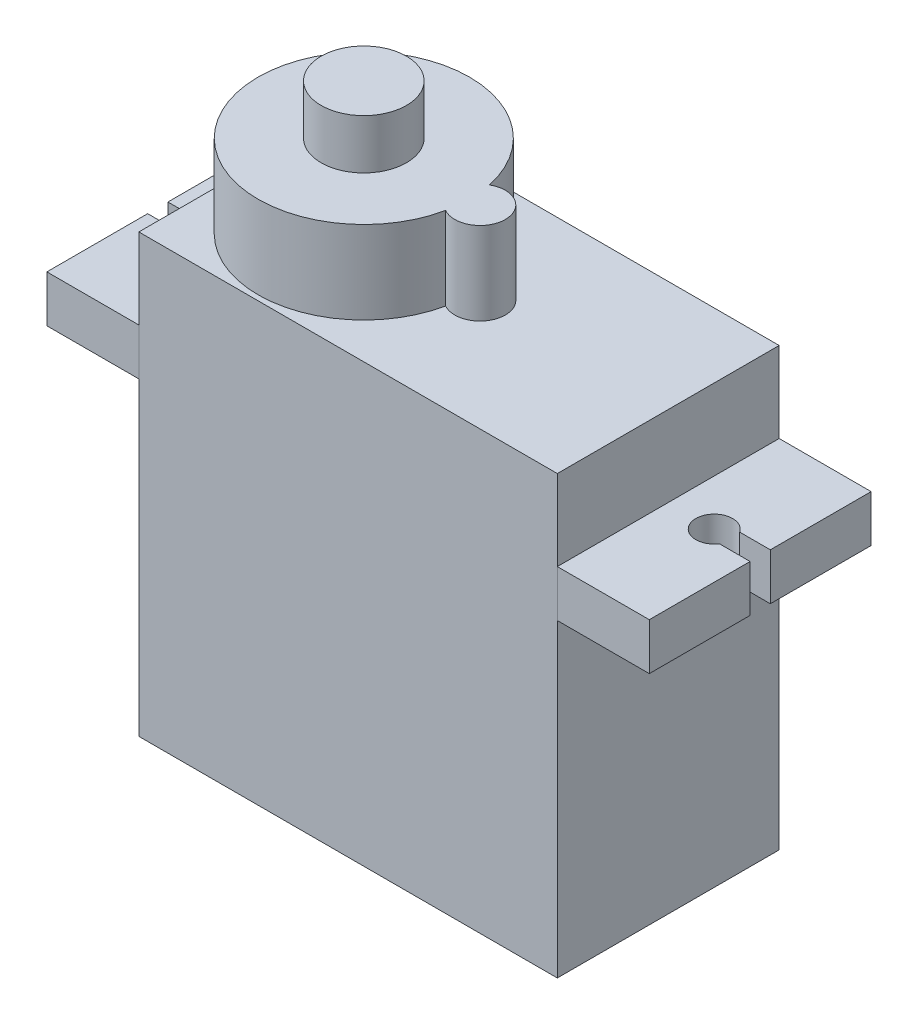
ISO-10303-21;
HEADER;
FILE_DESCRIPTION(('STEP AP214'),'2;1');
FILE_NAME('part.step','',(''),(''),'','','');
FILE_SCHEMA(('AUTOMOTIVE_DESIGN { 1 0 10303 214 1 1 1 1 }'));
ENDSEC;
DATA;
#1=APPLICATION_CONTEXT('core data for automotive mechanical design processes');
#2=APPLICATION_PROTOCOL_DEFINITION('international standard','automotive_design',2000,#1);
#3=PRODUCT_CONTEXT('',#1,'mechanical');
#4=PRODUCT('Part','Part','',(#3));
#5=PRODUCT_RELATED_PRODUCT_CATEGORY('part','',(#4));
#6=PRODUCT_DEFINITION_FORMATION('','',#4);
#7=PRODUCT_DEFINITION_CONTEXT('part definition',#1,'design');
#8=PRODUCT_DEFINITION('design','',#6,#7);
#9=PRODUCT_DEFINITION_SHAPE('','',#8);
#10=(LENGTH_UNIT() NAMED_UNIT(*) SI_UNIT(.MILLI.,.METRE.));
#11=(NAMED_UNIT(*) PLANE_ANGLE_UNIT() SI_UNIT($,.RADIAN.));
#12=(NAMED_UNIT(*) SI_UNIT($,.STERADIAN.) SOLID_ANGLE_UNIT());
#13=UNCERTAINTY_MEASURE_WITH_UNIT(LENGTH_MEASURE(1.E-05),#10,'distance_accuracy_value','');
#14=(GEOMETRIC_REPRESENTATION_CONTEXT(3) GLOBAL_UNCERTAINTY_ASSIGNED_CONTEXT((#13)) GLOBAL_UNIT_ASSIGNED_CONTEXT((#10,
#11,#12)) REPRESENTATION_CONTEXT('',''));
#15=CARTESIAN_POINT('',(0.,0.,0.));
#16=DIRECTION('',(0.,0.,1.));
#17=DIRECTION('',(1.,0.,0.));
#18=AXIS2_PLACEMENT_3D('',#15,#16,#17);
#19=CARTESIAN_POINT('',(-13.675,4.5,1.2));
#20=DIRECTION('',(1.,0.,0.));
#21=DIRECTION('',(0.,0.,-1.));
#22=AXIS2_PLACEMENT_3D('',#19,#20,#21);
#23=CYLINDRICAL_SURFACE('',#22,0.6);
#24=CARTESIAN_POINT('',(-13.675,4.5,1.2));
#25=DIRECTION('',(-1.,0.,0.));
#26=DIRECTION('',(0.,0.,1.));
#27=AXIS2_PLACEMENT_3D('',#24,#25,#26);
#28=CIRCLE('',#27,0.6);
#29=CARTESIAN_POINT('',(-13.675,4.5,1.8));
#30=VERTEX_POINT('',#29);
#31=EDGE_CURVE('E12',#30,#30,#28,.T.);
#32=ORIENTED_EDGE('',*,*,#31,.F.);
#33=EDGE_LOOP('',(#32));
#34=FACE_BOUND('',#33,.T.);
#35=CARTESIAN_POINT('',(-11.375,4.5,1.2));
#36=DIRECTION('',(-1.,0.,0.));
#37=DIRECTION('',(0.,0.,1.));
#38=AXIS2_PLACEMENT_3D('',#35,#36,#37);
#39=CIRCLE('',#38,0.6);
#40=CARTESIAN_POINT('',(-11.375,4.5,1.8));
#41=VERTEX_POINT('',#40);
#42=EDGE_CURVE('E52',#41,#41,#39,.T.);
#43=ORIENTED_EDGE('',*,*,#42,.T.);
#44=EDGE_LOOP('',(#43));
#45=FACE_BOUND('',#44,.T.);
#46=ADVANCED_FACE('F49',(#34,#45),#23,.T.);
#47=CARTESIAN_POINT('',(-13.675,0.,0.));
#48=DIRECTION('',(-1.,0.,0.));
#49=DIRECTION('',(0.,0.,1.));
#50=AXIS2_PLACEMENT_3D('',#47,#48,#49);
#51=PLANE('',#50);
#52=ORIENTED_EDGE('',*,*,#31,.T.);
#53=EDGE_LOOP('',(#52));
#54=FACE_BOUND('',#53,.T.);
#55=ADVANCED_FACE('F64',(#54),#51,.T.);
#56=CARTESIAN_POINT('',(-11.375,0.,0.));
#57=DIRECTION('',(-1.,0.,0.));
#58=DIRECTION('',(0.,0.,1.));
#59=AXIS2_PLACEMENT_3D('',#56,#57,#58);
#60=PLANE('',#59);
#61=ORIENTED_EDGE('',*,*,#42,.F.);
#62=EDGE_LOOP('',(#61));
#63=FACE_BOUND('',#62,.T.);
#64=ADVANCED_FACE('F62',(#63),#60,.F.);
#65=CLOSED_SHELL('',(#46,#55,#64));
#66=MANIFOLD_SOLID_BREP('B2',#65);
#67=CARTESIAN_POINT('',(-13.675,4.5,-1.2));
#68=DIRECTION('',(1.,0.,0.));
#69=DIRECTION('',(0.,0.,-1.));
#70=AXIS2_PLACEMENT_3D('',#67,#68,#69);
#71=CYLINDRICAL_SURFACE('',#70,0.6);
#72=CARTESIAN_POINT('',(-13.675,4.5,-1.2));
#73=DIRECTION('',(-1.,0.,0.));
#74=DIRECTION('',(0.,0.,1.));
#75=AXIS2_PLACEMENT_3D('',#72,#73,#74);
#76=CIRCLE('',#75,0.6);
#77=CARTESIAN_POINT('',(-13.675,4.5,-0.600000000000001));
#78=VERTEX_POINT('',#77);
#79=EDGE_CURVE('E48',#78,#78,#76,.T.);
#80=ORIENTED_EDGE('',*,*,#79,.F.);
#81=EDGE_LOOP('',(#80));
#82=FACE_BOUND('',#81,.T.);
#83=CARTESIAN_POINT('',(-11.375,4.5,-1.2));
#84=DIRECTION('',(-1.,0.,0.));
#85=DIRECTION('',(0.,0.,1.));
#86=AXIS2_PLACEMENT_3D('',#83,#84,#85);
#87=CIRCLE('',#86,0.6);
#88=CARTESIAN_POINT('',(-11.375,4.5,-0.600000000000001));
#89=VERTEX_POINT('',#88);
#90=EDGE_CURVE('E104',#89,#89,#87,.T.);
#91=ORIENTED_EDGE('',*,*,#90,.T.);
#92=EDGE_LOOP('',(#91));
#93=FACE_BOUND('',#92,.T.);
#94=ADVANCED_FACE('F101',(#82,#93),#71,.T.);
#95=CARTESIAN_POINT('',(-13.675,0.,0.));
#96=DIRECTION('',(-1.,0.,0.));
#97=DIRECTION('',(0.,0.,1.));
#98=AXIS2_PLACEMENT_3D('',#95,#96,#97);
#99=PLANE('',#98);
#100=ORIENTED_EDGE('',*,*,#79,.T.);
#101=EDGE_LOOP('',(#100));
#102=FACE_BOUND('',#101,.T.);
#103=ADVANCED_FACE('F116',(#102),#99,.T.);
#104=CARTESIAN_POINT('',(-11.375,0.,0.));
#105=DIRECTION('',(-1.,0.,0.));
#106=DIRECTION('',(0.,0.,1.));
#107=AXIS2_PLACEMENT_3D('',#104,#105,#106);
#108=PLANE('',#107);
#109=ORIENTED_EDGE('',*,*,#90,.F.);
#110=EDGE_LOOP('',(#109));
#111=FACE_BOUND('',#110,.T.);
#112=ADVANCED_FACE('F114',(#111),#108,.F.);
#113=CLOSED_SHELL('',(#94,#103,#112));
#114=MANIFOLD_SOLID_BREP('B7',#113);
#115=CARTESIAN_POINT('',(-13.675,4.5,0.));
#116=DIRECTION('',(1.,0.,0.));
#117=DIRECTION('',(0.,0.,-1.));
#118=AXIS2_PLACEMENT_3D('',#115,#116,#117);
#119=CYLINDRICAL_SURFACE('',#118,0.6);
#120=CARTESIAN_POINT('',(-13.675,4.5,0.));
#121=DIRECTION('',(-1.,0.,0.));
#122=DIRECTION('',(0.,0.,1.));
#123=AXIS2_PLACEMENT_3D('',#120,#121,#122);
#124=CIRCLE('',#123,0.6);
#125=CARTESIAN_POINT('',(-13.675,4.5,0.599999999999999));
#126=VERTEX_POINT('',#125);
#127=EDGE_CURVE('E100',#126,#126,#124,.T.);
#128=ORIENTED_EDGE('',*,*,#127,.F.);
#129=EDGE_LOOP('',(#128));
#130=FACE_BOUND('',#129,.T.);
#131=CARTESIAN_POINT('',(-11.375,4.5,0.));
#132=DIRECTION('',(-1.,0.,0.));
#133=DIRECTION('',(0.,0.,1.));
#134=AXIS2_PLACEMENT_3D('',#131,#132,#133);
#135=CIRCLE('',#134,0.6);
#136=CARTESIAN_POINT('',(-11.375,4.5,0.599999999999999));
#137=VERTEX_POINT('',#136);
#138=EDGE_CURVE('E158',#137,#137,#135,.T.);
#139=ORIENTED_EDGE('',*,*,#138,.T.);
#140=EDGE_LOOP('',(#139));
#141=FACE_BOUND('',#140,.T.);
#142=ADVANCED_FACE('F155',(#130,#141),#119,.T.);
#143=CARTESIAN_POINT('',(-13.675,0.,0.));
#144=DIRECTION('',(-1.,0.,0.));
#145=DIRECTION('',(0.,0.,1.));
#146=AXIS2_PLACEMENT_3D('',#143,#144,#145);
#147=PLANE('',#146);
#148=ORIENTED_EDGE('',*,*,#127,.T.);
#149=EDGE_LOOP('',(#148));
#150=FACE_BOUND('',#149,.T.);
#151=ADVANCED_FACE('F170',(#150),#147,.T.);
#152=CARTESIAN_POINT('',(-11.375,0.,0.));
#153=DIRECTION('',(-1.,0.,0.));
#154=DIRECTION('',(0.,0.,1.));
#155=AXIS2_PLACEMENT_3D('',#152,#153,#154);
#156=PLANE('',#155);
#157=ORIENTED_EDGE('',*,*,#138,.F.);
#158=EDGE_LOOP('',(#157));
#159=FACE_BOUND('',#158,.T.);
#160=ADVANCED_FACE('F168',(#159),#156,.F.);
#161=CLOSED_SHELL('',(#142,#151,#160));
#162=MANIFOLD_SOLID_BREP('B43',#161);
#163=CARTESIAN_POINT('',(-16.375,0.,0.));
#164=DIRECTION('',(-1.,0.,0.));
#165=DIRECTION('',(0.,0.,1.));
#166=AXIS2_PLACEMENT_3D('',#163,#164,#165);
#167=PLANE('',#166);
#168=DIRECTION('',(0.,1.,0.));
#169=VECTOR('',#168,1.);
#170=CARTESIAN_POINT('',(-16.375,-0.001000000000001,-0.55));
#171=LINE('',#170,#169);
#172=CARTESIAN_POINT('',(-16.375,16.83,-0.55));
#173=VERTEX_POINT('',#172);
#174=CARTESIAN_POINT('',(-16.375,19.37,-0.55));
#175=VERTEX_POINT('',#174);
#176=EDGE_CURVE('E339',#173,#175,#171,.T.);
#177=ORIENTED_EDGE('',*,*,#176,.T.);
#178=DIRECTION('',(0.,0.,-1.));
#179=VECTOR('',#178,1.);
#180=CARTESIAN_POINT('',(-16.375,19.37,6.03));
#181=LINE('',#180,#179);
#182=CARTESIAN_POINT('',(-16.375,19.37,-6.03));
#183=VERTEX_POINT('',#182);
#184=EDGE_CURVE('E262',#175,#183,#181,.T.);
#185=ORIENTED_EDGE('',*,*,#184,.T.);
#186=DIRECTION('',(0.,-1.,0.));
#187=VECTOR('',#186,1.);
#188=CARTESIAN_POINT('',(-16.375,19.37,-6.03));
#189=LINE('',#188,#187);
#190=CARTESIAN_POINT('',(-16.375,16.83,-6.03));
#191=VERTEX_POINT('',#190);
#192=EDGE_CURVE('E301',#183,#191,#189,.T.);
#193=ORIENTED_EDGE('',*,*,#192,.T.);
#194=DIRECTION('',(0.,0.,1.));
#195=VECTOR('',#194,1.);
#196=CARTESIAN_POINT('',(-16.375,16.83,-6.03));
#197=LINE('',#196,#195);
#198=EDGE_CURVE('E307',#191,#173,#197,.T.);
#199=ORIENTED_EDGE('',*,*,#198,.T.);
#200=EDGE_LOOP('',(#177,#185,#193,#199));
#201=FACE_BOUND('',#200,.T.);
#202=ADVANCED_FACE('F209',(#201),#167,.T.);
#203=CARTESIAN_POINT('',(-16.375,19.37,6.03));
#204=DIRECTION('',(0.,-1.,0.));
#205=DIRECTION('',(0.,0.,-1.));
#206=AXIS2_PLACEMENT_3D('',#203,#204,#205);
#207=PLANE('',#206);
#208=ORIENTED_EDGE('',*,*,#184,.F.);
#209=DIRECTION('',(-1.,0.,0.));
#210=VECTOR('',#209,1.);
#211=CARTESIAN_POINT('',(-16.375,19.37,-0.55));
#212=LINE('',#211,#210);
#213=CARTESIAN_POINT('',(-14.7101646544245,19.37,-0.55));
#214=VERTEX_POINT('',#213);
#215=EDGE_CURVE('E290',#214,#175,#212,.T.);
#216=ORIENTED_EDGE('',*,*,#215,.F.);
#217=CARTESIAN_POINT('',(-13.875,19.37,0.));
#218=DIRECTION('',(0.,1.,0.));
#219=DIRECTION('',(0.,0.,1.));
#220=AXIS2_PLACEMENT_3D('',#217,#218,#219);
#221=CIRCLE('',#220,1.);
#222=CARTESIAN_POINT('',(-14.7101646544245,19.37,0.55));
#223=VERTEX_POINT('',#222);
#224=EDGE_CURVE('E297',#223,#214,#221,.T.);
#225=ORIENTED_EDGE('',*,*,#224,.F.);
#226=DIRECTION('',(1.,0.,0.));
#227=VECTOR('',#226,1.);
#228=CARTESIAN_POINT('',(-16.375,19.37,0.55));
#229=LINE('',#228,#227);
#230=CARTESIAN_POINT('',(-16.375,19.37,0.55));
#231=VERTEX_POINT('',#230);
#232=EDGE_CURVE('E286',#231,#223,#229,.T.);
#233=ORIENTED_EDGE('',*,*,#232,.F.);
#234=CARTESIAN_POINT('',(-16.375,19.37,6.03));
#235=VERTEX_POINT('',#234);
#236=EDGE_CURVE('E294',#235,#231,#181,.T.);
#237=ORIENTED_EDGE('',*,*,#236,.F.);
#238=DIRECTION('',(1.,0.,0.));
#239=VECTOR('',#238,1.);
#240=CARTESIAN_POINT('',(-16.375,19.37,6.03));
#241=LINE('',#240,#239);
#242=CARTESIAN_POINT('',(-11.375,19.37,6.03));
#243=VERTEX_POINT('',#242);
#244=EDGE_CURVE('E311',#235,#243,#241,.T.);
#245=ORIENTED_EDGE('',*,*,#244,.T.);
#246=DIRECTION('',(0.,0.,-1.));
#247=VECTOR('',#246,1.);
#248=CARTESIAN_POINT('',(-11.375,19.37,6.03));
#249=LINE('',#248,#247);
#250=CARTESIAN_POINT('',(-11.375,19.37,-6.03));
#251=VERTEX_POINT('',#250);
#252=EDGE_CURVE('E312',#243,#251,#249,.T.);
#253=ORIENTED_EDGE('',*,*,#252,.T.);
#254=DIRECTION('',(1.,0.,0.));
#255=VECTOR('',#254,1.);
#256=CARTESIAN_POINT('',(-16.375,19.37,-6.03));
#257=LINE('',#256,#255);
#258=EDGE_CURVE('E153',#183,#251,#257,.T.);
#259=ORIENTED_EDGE('',*,*,#258,.F.);
#260=EDGE_LOOP('',(#208,#216,#225,#233,#237,#245,#253,#259));
#261=FACE_BOUND('',#260,.T.);
#262=ADVANCED_FACE('F211',(#261),#207,.F.);
#263=CARTESIAN_POINT('',(-16.375,19.37,-6.03));
#264=DIRECTION('',(0.,0.,1.));
#265=DIRECTION('',(1.,0.,0.));
#266=AXIS2_PLACEMENT_3D('',#263,#264,#265);
#267=PLANE('',#266);
#268=DIRECTION('',(0.,-1.,0.));
#269=VECTOR('',#268,1.);
#270=CARTESIAN_POINT('',(-11.375,19.37,-6.03));
#271=LINE('',#270,#269);
#272=CARTESIAN_POINT('',(-11.375,16.83,-6.03));
#273=VERTEX_POINT('',#272);
#274=EDGE_CURVE('E315',#251,#273,#271,.T.);
#275=ORIENTED_EDGE('',*,*,#274,.T.);
#276=DIRECTION('',(1.,0.,0.));
#277=VECTOR('',#276,1.);
#278=CARTESIAN_POINT('',(-16.375,16.83,-6.03));
#279=LINE('',#278,#277);
#280=EDGE_CURVE('E217',#191,#273,#279,.T.);
#281=ORIENTED_EDGE('',*,*,#280,.F.);
#282=ORIENTED_EDGE('',*,*,#192,.F.);
#283=ORIENTED_EDGE('',*,*,#258,.T.);
#284=EDGE_LOOP('',(#275,#281,#282,#283));
#285=FACE_BOUND('',#284,.T.);
#286=ADVANCED_FACE('F353',(#285),#267,.F.);
#287=CARTESIAN_POINT('',(-16.375,16.83,-6.03));
#288=DIRECTION('',(0.,1.,0.));
#289=DIRECTION('',(0.,0.,1.));
#290=AXIS2_PLACEMENT_3D('',#287,#288,#289);
#291=PLANE('',#290);
#292=CARTESIAN_POINT('',(-13.875,16.83,0.));
#293=DIRECTION('',(0.,1.,0.));
#294=DIRECTION('',(0.,0.,1.));
#295=AXIS2_PLACEMENT_3D('',#292,#293,#294);
#296=CIRCLE('',#295,1.);
#297=CARTESIAN_POINT('',(-14.7101646544245,16.83,-0.55));
#298=VERTEX_POINT('',#297);
#299=CARTESIAN_POINT('',(-14.7101646544245,16.83,0.55));
#300=VERTEX_POINT('',#299);
#301=EDGE_CURVE('E338',#298,#300,#296,.F.);
#302=ORIENTED_EDGE('',*,*,#301,.F.);
#303=DIRECTION('',(1.,0.,0.));
#304=VECTOR('',#303,1.);
#305=CARTESIAN_POINT('',(-16.375,16.83,-0.55));
#306=LINE('',#305,#304);
#307=EDGE_CURVE('E298',#173,#298,#306,.T.);
#308=ORIENTED_EDGE('',*,*,#307,.F.);
#309=ORIENTED_EDGE('',*,*,#198,.F.);
#310=ORIENTED_EDGE('',*,*,#280,.T.);
#311=DIRECTION('',(0.,0.,1.));
#312=VECTOR('',#311,1.);
#313=CARTESIAN_POINT('',(-11.375,16.83,-6.03));
#314=LINE('',#313,#312);
#315=CARTESIAN_POINT('',(-11.375,16.83,6.03));
#316=VERTEX_POINT('',#315);
#317=EDGE_CURVE('E317',#273,#316,#314,.T.);
#318=ORIENTED_EDGE('',*,*,#317,.T.);
#319=DIRECTION('',(1.,0.,0.));
#320=VECTOR('',#319,1.);
#321=CARTESIAN_POINT('',(-16.375,16.83,6.03));
#322=LINE('',#321,#320);
#323=CARTESIAN_POINT('',(-16.375,16.83,6.03));
#324=VERTEX_POINT('',#323);
#325=EDGE_CURVE('E321',#324,#316,#322,.T.);
#326=ORIENTED_EDGE('',*,*,#325,.F.);
#327=CARTESIAN_POINT('',(-16.375,16.83,0.55));
#328=VERTEX_POINT('',#327);
#329=EDGE_CURVE('E303',#328,#324,#197,.T.);
#330=ORIENTED_EDGE('',*,*,#329,.F.);
#331=DIRECTION('',(-1.,0.,0.));
#332=VECTOR('',#331,1.);
#333=CARTESIAN_POINT('',(-16.375,16.83,0.55));
#334=LINE('',#333,#332);
#335=EDGE_CURVE('E224',#300,#328,#334,.T.);
#336=ORIENTED_EDGE('',*,*,#335,.F.);
#337=EDGE_LOOP('',(#302,#308,#309,#310,#318,#326,#330,#336));
#338=FACE_BOUND('',#337,.T.);
#339=ADVANCED_FACE('F328',(#338),#291,.F.);
#340=CARTESIAN_POINT('',(-16.375,16.83,6.03));
#341=DIRECTION('',(0.,0.,-1.));
#342=DIRECTION('',(-1.,0.,0.));
#343=AXIS2_PLACEMENT_3D('',#340,#341,#342);
#344=PLANE('',#343);
#345=DIRECTION('',(0.,1.,0.));
#346=VECTOR('',#345,1.);
#347=CARTESIAN_POINT('',(-11.375,16.83,6.03));
#348=LINE('',#347,#346);
#349=EDGE_CURVE('E254',#316,#243,#348,.T.);
#350=ORIENTED_EDGE('',*,*,#349,.T.);
#351=ORIENTED_EDGE('',*,*,#244,.F.);
#352=DIRECTION('',(0.,1.,0.));
#353=VECTOR('',#352,1.);
#354=CARTESIAN_POINT('',(-16.375,16.83,6.03));
#355=LINE('',#354,#353);
#356=EDGE_CURVE('E233',#324,#235,#355,.T.);
#357=ORIENTED_EDGE('',*,*,#356,.F.);
#358=ORIENTED_EDGE('',*,*,#325,.T.);
#359=EDGE_LOOP('',(#350,#351,#357,#358));
#360=FACE_BOUND('',#359,.T.);
#361=ADVANCED_FACE('F336',(#360),#344,.F.);
#362=DIRECTION('',(0.,1.,0.));
#363=VECTOR('',#362,1.);
#364=CARTESIAN_POINT('',(-16.375,-0.001000000000001,0.55));
#365=LINE('',#364,#363);
#366=EDGE_CURVE('E283',#328,#231,#365,.T.);
#367=ORIENTED_EDGE('',*,*,#366,.F.);
#368=ORIENTED_EDGE('',*,*,#329,.T.);
#369=ORIENTED_EDGE('',*,*,#356,.T.);
#370=ORIENTED_EDGE('',*,*,#236,.T.);
#371=EDGE_LOOP('',(#367,#368,#369,#370));
#372=FACE_BOUND('',#371,.T.);
#373=ADVANCED_FACE('F300',(#372),#167,.T.);
#374=CARTESIAN_POINT('',(-11.375,0.,0.));
#375=DIRECTION('',(-1.,0.,0.));
#376=DIRECTION('',(0.,0.,1.));
#377=AXIS2_PLACEMENT_3D('',#374,#375,#376);
#378=PLANE('',#377);
#379=ORIENTED_EDGE('',*,*,#252,.F.);
#380=ORIENTED_EDGE('',*,*,#349,.F.);
#381=ORIENTED_EDGE('',*,*,#317,.F.);
#382=ORIENTED_EDGE('',*,*,#274,.F.);
#383=EDGE_LOOP('',(#379,#380,#381,#382));
#384=FACE_BOUND('',#383,.T.);
#385=ADVANCED_FACE('F334',(#384),#378,.F.);
#386=CARTESIAN_POINT('',(-16.375,-0.001000000000001,-0.55));
#387=DIRECTION('',(0.,0.,-1.));
#388=DIRECTION('',(-1.,0.,0.));
#389=AXIS2_PLACEMENT_3D('',#386,#387,#388);
#390=PLANE('',#389);
#391=ORIENTED_EDGE('',*,*,#307,.T.);
#392=DIRECTION('',(0.,1.,0.));
#393=VECTOR('',#392,1.);
#394=CARTESIAN_POINT('',(-14.7101646544245,-0.001000000000001,-0.55));
#395=LINE('',#394,#393);
#396=EDGE_CURVE('E340',#298,#214,#395,.T.);
#397=ORIENTED_EDGE('',*,*,#396,.T.);
#398=ORIENTED_EDGE('',*,*,#215,.T.);
#399=ORIENTED_EDGE('',*,*,#176,.F.);
#400=EDGE_LOOP('',(#391,#397,#398,#399));
#401=FACE_BOUND('',#400,.T.);
#402=ADVANCED_FACE('F352',(#401),#390,.F.);
#403=CARTESIAN_POINT('',(-13.875,-0.001000000000001,0.));
#404=DIRECTION('',(0.,1.,0.));
#405=DIRECTION('',(0.,0.,1.));
#406=AXIS2_PLACEMENT_3D('',#403,#404,#405);
#407=CYLINDRICAL_SURFACE('',#406,1.);
#408=ORIENTED_EDGE('',*,*,#301,.T.);
#409=DIRECTION('',(0.,1.,0.));
#410=VECTOR('',#409,1.);
#411=CARTESIAN_POINT('',(-14.7101646544245,-0.001000000000001,0.55));
#412=LINE('',#411,#410);
#413=EDGE_CURVE('E289',#300,#223,#412,.T.);
#414=ORIENTED_EDGE('',*,*,#413,.T.);
#415=ORIENTED_EDGE('',*,*,#224,.T.);
#416=ORIENTED_EDGE('',*,*,#396,.F.);
#417=EDGE_LOOP('',(#408,#414,#415,#416));
#418=FACE_BOUND('',#417,.T.);
#419=ADVANCED_FACE('F347',(#418),#407,.F.);
#420=CARTESIAN_POINT('',(-16.375,-0.001000000000001,0.55));
#421=DIRECTION('',(0.,0.,1.));
#422=DIRECTION('',(1.,0.,0.));
#423=AXIS2_PLACEMENT_3D('',#420,#421,#422);
#424=PLANE('',#423);
#425=ORIENTED_EDGE('',*,*,#335,.T.);
#426=ORIENTED_EDGE('',*,*,#366,.T.);
#427=ORIENTED_EDGE('',*,*,#232,.T.);
#428=ORIENTED_EDGE('',*,*,#413,.F.);
#429=EDGE_LOOP('',(#425,#426,#427,#428));
#430=FACE_BOUND('',#429,.T.);
#431=ADVANCED_FACE('F285',(#430),#424,.F.);
#432=CLOSED_SHELL('',(#202,#262,#286,#339,#361,#373,#385,#402,#419,#431));
#433=MANIFOLD_SOLID_BREP('B95',#432);
#434=CARTESIAN_POINT('',(16.375,16.83,6.03));
#435=DIRECTION('',(0.,1.,0.));
#436=DIRECTION('',(0.,0.,1.));
#437=AXIS2_PLACEMENT_3D('',#434,#435,#436);
#438=PLANE('',#437);
#439=DIRECTION('',(-1.,0.,0.));
#440=VECTOR('',#439,1.);
#441=CARTESIAN_POINT('',(14.7101646544245,16.83,-0.55));
#442=LINE('',#441,#440);
#443=CARTESIAN_POINT('',(16.375,16.83,-0.55));
#444=VERTEX_POINT('',#443);
#445=CARTESIAN_POINT('',(14.7101646544245,16.83,-0.55));
#446=VERTEX_POINT('',#445);
#447=EDGE_CURVE('E534',#444,#446,#442,.T.);
#448=ORIENTED_EDGE('',*,*,#447,.T.);
#449=CARTESIAN_POINT('',(13.875,16.83,0.));
#450=DIRECTION('',(0.,1.,0.));
#451=DIRECTION('',(0.,0.,1.));
#452=AXIS2_PLACEMENT_3D('',#449,#450,#451);
#453=CIRCLE('',#452,1.);
#454=CARTESIAN_POINT('',(14.7101646544245,16.83,0.55));
#455=VERTEX_POINT('',#454);
#456=EDGE_CURVE('E521',#455,#446,#453,.F.);
#457=ORIENTED_EDGE('',*,*,#456,.F.);
#458=DIRECTION('',(-1.,0.,0.));
#459=VECTOR('',#458,1.);
#460=CARTESIAN_POINT('',(14.7101646544245,16.83,0.55));
#461=LINE('',#460,#459);
#462=CARTESIAN_POINT('',(16.375,16.83,0.55));
#463=VERTEX_POINT('',#462);
#464=EDGE_CURVE('E528',#463,#455,#461,.T.);
#465=ORIENTED_EDGE('',*,*,#464,.F.);
#466=DIRECTION('',(0.,0.,-1.));
#467=VECTOR('',#466,1.);
#468=CARTESIAN_POINT('',(16.375,16.83,6.03));
#469=LINE('',#468,#467);
#470=CARTESIAN_POINT('',(16.375,16.83,6.03));
#471=VERTEX_POINT('',#470);
#472=EDGE_CURVE('E494',#471,#463,#469,.T.);
#473=ORIENTED_EDGE('',*,*,#472,.F.);
#474=DIRECTION('',(-1.,0.,0.));
#475=VECTOR('',#474,1.);
#476=CARTESIAN_POINT('',(16.375,16.83,6.03));
#477=LINE('',#476,#475);
#478=CARTESIAN_POINT('',(11.375,16.83,6.03));
#479=VERTEX_POINT('',#478);
#480=EDGE_CURVE('E207',#471,#479,#477,.T.);
#481=ORIENTED_EDGE('',*,*,#480,.T.);
#482=DIRECTION('',(0.,0.,-1.));
#483=VECTOR('',#482,1.);
#484=CARTESIAN_POINT('',(11.375,16.83,6.03));
#485=LINE('',#484,#483);
#486=CARTESIAN_POINT('',(11.375,16.83,-6.03));
#487=VERTEX_POINT('',#486);
#488=EDGE_CURVE('E558',#479,#487,#485,.T.);
#489=ORIENTED_EDGE('',*,*,#488,.T.);
#490=DIRECTION('',(-1.,0.,0.));
#491=VECTOR('',#490,1.);
#492=CARTESIAN_POINT('',(16.375,16.83,-6.03));
#493=LINE('',#492,#491);
#494=CARTESIAN_POINT('',(16.375,16.83,-6.03));
#495=VERTEX_POINT('',#494);
#496=EDGE_CURVE('E450',#495,#487,#493,.T.);
#497=ORIENTED_EDGE('',*,*,#496,.F.);
#498=EDGE_CURVE('E548',#444,#495,#469,.T.);
#499=ORIENTED_EDGE('',*,*,#498,.F.);
#500=EDGE_LOOP('',(#448,#457,#465,#473,#481,#489,#497,#499));
#501=FACE_BOUND('',#500,.T.);
#502=ADVANCED_FACE('F442',(#501),#438,.F.);
#503=CARTESIAN_POINT('',(16.375,19.37,6.03));
#504=DIRECTION('',(0.,-1.,0.));
#505=DIRECTION('',(0.,0.,-1.));
#506=AXIS2_PLACEMENT_3D('',#503,#504,#505);
#507=PLANE('',#506);
#508=DIRECTION('',(1.,0.,0.));
#509=VECTOR('',#508,1.);
#510=CARTESIAN_POINT('',(14.7101646544245,19.37,-0.55));
#511=LINE('',#510,#509);
#512=CARTESIAN_POINT('',(14.7101646544245,19.37,-0.55));
#513=VERTEX_POINT('',#512);
#514=CARTESIAN_POINT('',(16.375,19.37,-0.55));
#515=VERTEX_POINT('',#514);
#516=EDGE_CURVE('E526',#513,#515,#511,.T.);
#517=ORIENTED_EDGE('',*,*,#516,.T.);
#518=DIRECTION('',(0.,0.,1.));
#519=VECTOR('',#518,1.);
#520=CARTESIAN_POINT('',(16.375,19.37,6.03));
#521=LINE('',#520,#519);
#522=CARTESIAN_POINT('',(16.375,19.37,-6.03));
#523=VERTEX_POINT('',#522);
#524=EDGE_CURVE('E552',#523,#515,#521,.T.);
#525=ORIENTED_EDGE('',*,*,#524,.F.);
#526=DIRECTION('',(-1.,0.,0.));
#527=VECTOR('',#526,1.);
#528=CARTESIAN_POINT('',(16.375,19.37,-6.03));
#529=LINE('',#528,#527);
#530=CARTESIAN_POINT('',(11.375,19.37,-6.03));
#531=VERTEX_POINT('',#530);
#532=EDGE_CURVE('E564',#523,#531,#529,.T.);
#533=ORIENTED_EDGE('',*,*,#532,.T.);
#534=DIRECTION('',(0.,0.,1.));
#535=VECTOR('',#534,1.);
#536=CARTESIAN_POINT('',(11.375,19.37,6.03));
#537=LINE('',#536,#535);
#538=CARTESIAN_POINT('',(11.375,19.37,6.03));
#539=VERTEX_POINT('',#538);
#540=EDGE_CURVE('E487',#531,#539,#537,.T.);
#541=ORIENTED_EDGE('',*,*,#540,.T.);
#542=DIRECTION('',(-1.,0.,0.));
#543=VECTOR('',#542,1.);
#544=CARTESIAN_POINT('',(16.375,19.37,6.03));
#545=LINE('',#544,#543);
#546=CARTESIAN_POINT('',(16.375,19.37,6.03));
#547=VERTEX_POINT('',#546);
#548=EDGE_CURVE('E555',#547,#539,#545,.T.);
#549=ORIENTED_EDGE('',*,*,#548,.F.);
#550=CARTESIAN_POINT('',(16.375,19.37,0.55));
#551=VERTEX_POINT('',#550);
#552=EDGE_CURVE('E465',#551,#547,#521,.T.);
#553=ORIENTED_EDGE('',*,*,#552,.F.);
#554=DIRECTION('',(1.,0.,0.));
#555=VECTOR('',#554,1.);
#556=CARTESIAN_POINT('',(14.7101646544245,19.37,0.55));
#557=LINE('',#556,#555);
#558=CARTESIAN_POINT('',(14.7101646544245,19.37,0.55));
#559=VERTEX_POINT('',#558);
#560=EDGE_CURVE('E457',#559,#551,#557,.T.);
#561=ORIENTED_EDGE('',*,*,#560,.F.);
#562=CARTESIAN_POINT('',(13.875,19.37,0.));
#563=DIRECTION('',(0.,1.,0.));
#564=DIRECTION('',(0.,0.,1.));
#565=AXIS2_PLACEMENT_3D('',#562,#563,#564);
#566=CIRCLE('',#565,1.);
#567=EDGE_CURVE('E524',#513,#559,#566,.T.);
#568=ORIENTED_EDGE('',*,*,#567,.F.);
#569=EDGE_LOOP('',(#517,#525,#533,#541,#549,#553,#561,#568));
#570=FACE_BOUND('',#569,.T.);
#571=ADVANCED_FACE('F578',(#570),#507,.F.);
#572=CARTESIAN_POINT('',(16.375,0.,0.));
#573=DIRECTION('',(1.,0.,0.));
#574=DIRECTION('',(0.,0.,-1.));
#575=AXIS2_PLACEMENT_3D('',#572,#573,#574);
#576=PLANE('',#575);
#577=ORIENTED_EDGE('',*,*,#524,.T.);
#578=DIRECTION('',(0.,1.,0.));
#579=VECTOR('',#578,1.);
#580=CARTESIAN_POINT('',(16.375,-0.001000000000001,-0.55));
#581=LINE('',#580,#579);
#582=EDGE_CURVE('E543',#444,#515,#581,.T.);
#583=ORIENTED_EDGE('',*,*,#582,.F.);
#584=ORIENTED_EDGE('',*,*,#498,.T.);
#585=DIRECTION('',(0.,1.,0.));
#586=VECTOR('',#585,1.);
#587=CARTESIAN_POINT('',(16.375,19.37,-6.03));
#588=LINE('',#587,#586);
#589=EDGE_CURVE('E550',#495,#523,#588,.T.);
#590=ORIENTED_EDGE('',*,*,#589,.T.);
#591=EDGE_LOOP('',(#577,#583,#584,#590));
#592=FACE_BOUND('',#591,.T.);
#593=ADVANCED_FACE('F584',(#592),#576,.T.);
#594=CARTESIAN_POINT('',(16.375,19.37,6.03));
#595=DIRECTION('',(0.,0.,-1.));
#596=DIRECTION('',(-1.,0.,0.));
#597=AXIS2_PLACEMENT_3D('',#594,#595,#596);
#598=PLANE('',#597);
#599=DIRECTION('',(0.,-1.,0.));
#600=VECTOR('',#599,1.);
#601=CARTESIAN_POINT('',(11.375,19.37,6.03));
#602=LINE('',#601,#600);
#603=EDGE_CURVE('E530',#539,#479,#602,.T.);
#604=ORIENTED_EDGE('',*,*,#603,.T.);
#605=ORIENTED_EDGE('',*,*,#480,.F.);
#606=DIRECTION('',(0.,-1.,0.));
#607=VECTOR('',#606,1.);
#608=CARTESIAN_POINT('',(16.375,19.37,6.03));
#609=LINE('',#608,#607);
#610=EDGE_CURVE('E546',#547,#471,#609,.T.);
#611=ORIENTED_EDGE('',*,*,#610,.F.);
#612=ORIENTED_EDGE('',*,*,#548,.T.);
#613=EDGE_LOOP('',(#604,#605,#611,#612));
#614=FACE_BOUND('',#613,.T.);
#615=ADVANCED_FACE('F444',(#614),#598,.F.);
#616=CARTESIAN_POINT('',(16.375,19.37,-6.03));
#617=DIRECTION('',(0.,0.,1.));
#618=DIRECTION('',(1.,0.,0.));
#619=AXIS2_PLACEMENT_3D('',#616,#617,#618);
#620=PLANE('',#619);
#621=DIRECTION('',(0.,1.,0.));
#622=VECTOR('',#621,1.);
#623=CARTESIAN_POINT('',(11.375,19.37,-6.03));
#624=LINE('',#623,#622);
#625=EDGE_CURVE('E560',#487,#531,#624,.T.);
#626=ORIENTED_EDGE('',*,*,#625,.T.);
#627=ORIENTED_EDGE('',*,*,#532,.F.);
#628=ORIENTED_EDGE('',*,*,#589,.F.);
#629=ORIENTED_EDGE('',*,*,#496,.T.);
#630=EDGE_LOOP('',(#626,#627,#628,#629));
#631=FACE_BOUND('',#630,.T.);
#632=ADVANCED_FACE('F570',(#631),#620,.F.);
#633=DIRECTION('',(0.,1.,0.));
#634=VECTOR('',#633,1.);
#635=CARTESIAN_POINT('',(16.375,-0.001000000000001,0.55));
#636=LINE('',#635,#634);
#637=EDGE_CURVE('E525',#463,#551,#636,.T.);
#638=ORIENTED_EDGE('',*,*,#637,.T.);
#639=ORIENTED_EDGE('',*,*,#552,.T.);
#640=ORIENTED_EDGE('',*,*,#610,.T.);
#641=ORIENTED_EDGE('',*,*,#472,.T.);
#642=EDGE_LOOP('',(#638,#639,#640,#641));
#643=FACE_BOUND('',#642,.T.);
#644=ADVANCED_FACE('F601',(#643),#576,.T.);
#645=CARTESIAN_POINT('',(11.375,0.,0.));
#646=DIRECTION('',(1.,0.,0.));
#647=DIRECTION('',(0.,0.,-1.));
#648=AXIS2_PLACEMENT_3D('',#645,#646,#647);
#649=PLANE('',#648);
#650=ORIENTED_EDGE('',*,*,#603,.F.);
#651=ORIENTED_EDGE('',*,*,#540,.F.);
#652=ORIENTED_EDGE('',*,*,#625,.F.);
#653=ORIENTED_EDGE('',*,*,#488,.F.);
#654=EDGE_LOOP('',(#650,#651,#652,#653));
#655=FACE_BOUND('',#654,.T.);
#656=ADVANCED_FACE('F574',(#655),#649,.F.);
#657=CARTESIAN_POINT('',(13.875,-0.001000000000001,0.));
#658=DIRECTION('',(0.,1.,0.));
#659=DIRECTION('',(0.,0.,1.));
#660=AXIS2_PLACEMENT_3D('',#657,#658,#659);
#661=CYLINDRICAL_SURFACE('',#660,1.);
#662=ORIENTED_EDGE('',*,*,#456,.T.);
#663=DIRECTION('',(0.,1.,0.));
#664=VECTOR('',#663,1.);
#665=CARTESIAN_POINT('',(14.7101646544245,-0.001000000000001,-0.55));
#666=LINE('',#665,#664);
#667=EDGE_CURVE('E531',#446,#513,#666,.T.);
#668=ORIENTED_EDGE('',*,*,#667,.T.);
#669=ORIENTED_EDGE('',*,*,#567,.T.);
#670=DIRECTION('',(0.,1.,0.));
#671=VECTOR('',#670,1.);
#672=CARTESIAN_POINT('',(14.7101646544245,-0.001000000000001,0.55));
#673=LINE('',#672,#671);
#674=EDGE_CURVE('E517',#455,#559,#673,.T.);
#675=ORIENTED_EDGE('',*,*,#674,.F.);
#676=EDGE_LOOP('',(#662,#668,#669,#675));
#677=FACE_BOUND('',#676,.T.);
#678=ADVANCED_FACE('F519',(#677),#661,.F.);
#679=CARTESIAN_POINT('',(14.7101646544245,-0.001000000000001,-0.55));
#680=DIRECTION('',(0.,0.,1.));
#681=DIRECTION('',(1.,0.,0.));
#682=AXIS2_PLACEMENT_3D('',#679,#680,#681);
#683=PLANE('',#682);
#684=ORIENTED_EDGE('',*,*,#582,.T.);
#685=ORIENTED_EDGE('',*,*,#516,.F.);
#686=ORIENTED_EDGE('',*,*,#667,.F.);
#687=ORIENTED_EDGE('',*,*,#447,.F.);
#688=EDGE_LOOP('',(#684,#685,#686,#687));
#689=FACE_BOUND('',#688,.T.);
#690=ADVANCED_FACE('F585',(#689),#683,.T.);
#691=CARTESIAN_POINT('',(14.7101646544245,-0.001000000000001,0.55));
#692=DIRECTION('',(0.,0.,1.));
#693=DIRECTION('',(1.,0.,0.));
#694=AXIS2_PLACEMENT_3D('',#691,#692,#693);
#695=PLANE('',#694);
#696=ORIENTED_EDGE('',*,*,#464,.T.);
#697=ORIENTED_EDGE('',*,*,#674,.T.);
#698=ORIENTED_EDGE('',*,*,#560,.T.);
#699=ORIENTED_EDGE('',*,*,#637,.F.);
#700=EDGE_LOOP('',(#696,#697,#698,#699));
#701=FACE_BOUND('',#700,.T.);
#702=ADVANCED_FACE('F529',(#701),#695,.F.);
#703=CLOSED_SHELL('',(#502,#571,#593,#615,#632,#644,#656,#678,#690,#702));
#704=MANIFOLD_SOLID_BREP('B147',#703);
#705=CARTESIAN_POINT('',(11.375,23.75,6.03));
#706=DIRECTION('',(-1.,0.,0.));
#707=DIRECTION('',(0.,0.,1.));
#708=AXIS2_PLACEMENT_3D('',#705,#706,#707);
#709=PLANE('',#708);
#710=DIRECTION('',(0.,0.,-1.));
#711=VECTOR('',#710,1.);
#712=CARTESIAN_POINT('',(11.375,0.,6.03));
#713=LINE('',#712,#711);
#714=CARTESIAN_POINT('',(11.375,0.,6.03));
#715=VERTEX_POINT('',#714);
#716=CARTESIAN_POINT('',(11.375,0.,-6.03));
#717=VERTEX_POINT('',#716);
#718=EDGE_CURVE('E743',#715,#717,#713,.T.);
#719=ORIENTED_EDGE('',*,*,#718,.T.);
#720=DIRECTION('',(0.,-1.,0.));
#721=VECTOR('',#720,1.);
#722=CARTESIAN_POINT('',(11.375,23.75,-6.03));
#723=LINE('',#722,#721);
#724=CARTESIAN_POINT('',(11.375,23.75,-6.03));
#725=VERTEX_POINT('',#724);
#726=EDGE_CURVE('E440',#725,#717,#723,.T.);
#727=ORIENTED_EDGE('',*,*,#726,.F.);
#728=DIRECTION('',(0.,0.,-1.));
#729=VECTOR('',#728,1.);
#730=CARTESIAN_POINT('',(11.375,23.75,6.03));
#731=LINE('',#730,#729);
#732=CARTESIAN_POINT('',(11.375,23.75,6.03));
#733=VERTEX_POINT('',#732);
#734=EDGE_CURVE('E751',#733,#725,#731,.T.);
#735=ORIENTED_EDGE('',*,*,#734,.F.);
#736=DIRECTION('',(0.,-1.,0.));
#737=VECTOR('',#736,1.);
#738=CARTESIAN_POINT('',(11.375,23.75,6.03));
#739=LINE('',#738,#737);
#740=EDGE_CURVE('E756',#733,#715,#739,.T.);
#741=ORIENTED_EDGE('',*,*,#740,.T.);
#742=EDGE_LOOP('',(#719,#727,#735,#741));
#743=FACE_BOUND('',#742,.T.);
#744=ADVANCED_FACE('F666',(#743),#709,.F.);
#745=CARTESIAN_POINT('',(-11.375,23.75,-6.03));
#746=DIRECTION('',(0.,0.,1.));
#747=DIRECTION('',(1.,0.,0.));
#748=AXIS2_PLACEMENT_3D('',#745,#746,#747);
#749=PLANE('',#748);
#750=DIRECTION('',(-1.,0.,0.));
#751=VECTOR('',#750,1.);
#752=CARTESIAN_POINT('',(-11.375,0.,-6.03));
#753=LINE('',#752,#751);
#754=CARTESIAN_POINT('',(-11.375,0.,-6.03));
#755=VERTEX_POINT('',#754);
#756=EDGE_CURVE('E746',#717,#755,#753,.T.);
#757=ORIENTED_EDGE('',*,*,#756,.T.);
#758=DIRECTION('',(0.,-1.,0.));
#759=VECTOR('',#758,1.);
#760=CARTESIAN_POINT('',(-11.375,23.75,-6.03));
#761=LINE('',#760,#759);
#762=CARTESIAN_POINT('',(-11.375,23.75,-6.03));
#763=VERTEX_POINT('',#762);
#764=EDGE_CURVE('E673',#763,#755,#761,.T.);
#765=ORIENTED_EDGE('',*,*,#764,.F.);
#766=DIRECTION('',(-1.,0.,0.));
#767=VECTOR('',#766,1.);
#768=CARTESIAN_POINT('',(-11.375,23.75,-6.03));
#769=LINE('',#768,#767);
#770=EDGE_CURVE('E716',#725,#763,#769,.T.);
#771=ORIENTED_EDGE('',*,*,#770,.F.);
#772=ORIENTED_EDGE('',*,*,#726,.T.);
#773=EDGE_LOOP('',(#757,#765,#771,#772));
#774=FACE_BOUND('',#773,.T.);
#775=ADVANCED_FACE('F785',(#774),#749,.F.);
#776=CARTESIAN_POINT('',(-11.375,23.75,6.03));
#777=DIRECTION('',(1.,0.,0.));
#778=DIRECTION('',(0.,0.,-1.));
#779=AXIS2_PLACEMENT_3D('',#776,#777,#778);
#780=PLANE('',#779);
#781=DIRECTION('',(0.,0.,1.));
#782=VECTOR('',#781,1.);
#783=CARTESIAN_POINT('',(-11.375,0.,6.03));
#784=LINE('',#783,#782);
#785=CARTESIAN_POINT('',(-11.375,0.,6.03));
#786=VERTEX_POINT('',#785);
#787=EDGE_CURVE('E759',#755,#786,#784,.T.);
#788=ORIENTED_EDGE('',*,*,#787,.T.);
#789=DIRECTION('',(0.,-1.,0.));
#790=VECTOR('',#789,1.);
#791=CARTESIAN_POINT('',(-11.375,23.75,6.03));
#792=LINE('',#791,#790);
#793=CARTESIAN_POINT('',(-11.375,23.75,6.03));
#794=VERTEX_POINT('',#793);
#795=EDGE_CURVE('E763',#794,#786,#792,.T.);
#796=ORIENTED_EDGE('',*,*,#795,.F.);
#797=DIRECTION('',(0.,0.,1.));
#798=VECTOR('',#797,1.);
#799=CARTESIAN_POINT('',(-11.375,23.75,6.03));
#800=LINE('',#799,#798);
#801=EDGE_CURVE('E754',#763,#794,#800,.T.);
#802=ORIENTED_EDGE('',*,*,#801,.F.);
#803=ORIENTED_EDGE('',*,*,#764,.T.);
#804=EDGE_LOOP('',(#788,#796,#802,#803));
#805=FACE_BOUND('',#804,.T.);
#806=ADVANCED_FACE('F768',(#805),#780,.F.);
#807=CARTESIAN_POINT('',(-11.375,23.75,6.03));
#808=DIRECTION('',(0.,0.,-1.));
#809=DIRECTION('',(-1.,0.,0.));
#810=AXIS2_PLACEMENT_3D('',#807,#808,#809);
#811=PLANE('',#810);
#812=DIRECTION('',(1.,0.,0.));
#813=VECTOR('',#812,1.);
#814=CARTESIAN_POINT('',(-11.375,0.,6.03));
#815=LINE('',#814,#813);
#816=EDGE_CURVE('E709',#786,#715,#815,.T.);
#817=ORIENTED_EDGE('',*,*,#816,.T.);
#818=ORIENTED_EDGE('',*,*,#740,.F.);
#819=DIRECTION('',(1.,0.,0.));
#820=VECTOR('',#819,1.);
#821=CARTESIAN_POINT('',(-11.375,23.75,6.03));
#822=LINE('',#821,#820);
#823=EDGE_CURVE('E688',#794,#733,#822,.T.);
#824=ORIENTED_EDGE('',*,*,#823,.F.);
#825=ORIENTED_EDGE('',*,*,#795,.T.);
#826=EDGE_LOOP('',(#817,#818,#824,#825));
#827=FACE_BOUND('',#826,.T.);
#828=ADVANCED_FACE('F776',(#827),#811,.F.);
#829=CARTESIAN_POINT('',(0.,23.75,0.));
#830=DIRECTION('',(0.,-1.,0.));
#831=DIRECTION('',(0.,0.,-1.));
#832=AXIS2_PLACEMENT_3D('',#829,#830,#831);
#833=PLANE('',#832);
#834=CARTESIAN_POINT('',(1.12497026899481,23.75,-0.0193548387096772));
#835=DIRECTION('',(0.,1.,0.));
#836=DIRECTION('',(0.,0.,1.));
#837=AXIS2_PLACEMENT_3D('',#834,#835,#836);
#838=CIRCLE('',#837,1.375);
#839=CARTESIAN_POINT('',(0.452610217595676,23.75,1.1800437444488));
#840=VERTEX_POINT('',#839);
#841=CARTESIAN_POINT('',(0.445253367821972,23.75,-1.21459955602074));
#842=VERTEX_POINT('',#841);
#843=EDGE_CURVE('E742',#840,#842,#838,.T.);
#844=ORIENTED_EDGE('',*,*,#843,.F.);
#845=CARTESIAN_POINT('',(-5.175,23.75,0.));
#846=DIRECTION('',(0.,1.,0.));
#847=DIRECTION('',(0.,0.,1.));
#848=AXIS2_PLACEMENT_3D('',#845,#846,#847);
#849=CIRCLE('',#848,5.75);
#850=EDGE_CURVE('E679',#842,#840,#849,.T.);
#851=ORIENTED_EDGE('',*,*,#850,.F.);
#852=EDGE_LOOP('',(#844,#851));
#853=FACE_BOUND('',#852,.T.);
#854=ORIENTED_EDGE('',*,*,#734,.T.);
#855=ORIENTED_EDGE('',*,*,#770,.T.);
#856=ORIENTED_EDGE('',*,*,#801,.T.);
#857=ORIENTED_EDGE('',*,*,#823,.T.);
#858=EDGE_LOOP('',(#854,#855,#856,#857));
#859=FACE_BOUND('',#858,.T.);
#860=ADVANCED_FACE('F778',(#853,#859),#833,.F.);
#861=CARTESIAN_POINT('',(0.,0.,0.));
#862=DIRECTION('',(0.,-1.,0.));
#863=DIRECTION('',(0.,0.,-1.));
#864=AXIS2_PLACEMENT_3D('',#861,#862,#863);
#865=PLANE('',#864);
#866=ORIENTED_EDGE('',*,*,#718,.F.);
#867=ORIENTED_EDGE('',*,*,#816,.F.);
#868=ORIENTED_EDGE('',*,*,#787,.F.);
#869=ORIENTED_EDGE('',*,*,#756,.F.);
#870=EDGE_LOOP('',(#866,#867,#868,#869));
#871=FACE_BOUND('',#870,.T.);
#872=ADVANCED_FACE('F772',(#871),#865,.T.);
#873=CARTESIAN_POINT('',(1.12497026899481,28.25,-0.0193548387096772));
#874=DIRECTION('',(0.,-1.,0.));
#875=DIRECTION('',(0.,0.,-1.));
#876=AXIS2_PLACEMENT_3D('',#873,#874,#875);
#877=CYLINDRICAL_SURFACE('',#876,1.375);
#878=ORIENTED_EDGE('',*,*,#843,.T.);
#879=DIRECTION('',(0.,-1.,0.));
#880=VECTOR('',#879,1.);
#881=CARTESIAN_POINT('',(0.445253367821972,28.25,-1.21459955602074));
#882=LINE('',#881,#880);
#883=CARTESIAN_POINT('',(0.445253367821972,28.25,-1.21459955602074));
#884=VERTEX_POINT('',#883);
#885=EDGE_CURVE('E730',#884,#842,#882,.T.);
#886=ORIENTED_EDGE('',*,*,#885,.F.);
#887=CARTESIAN_POINT('',(1.12497026899481,28.25,-0.0193548387096772));
#888=DIRECTION('',(0.,1.,0.));
#889=DIRECTION('',(0.,0.,1.));
#890=AXIS2_PLACEMENT_3D('',#887,#888,#889);
#891=CIRCLE('',#890,1.375);
#892=CARTESIAN_POINT('',(0.452610217595676,28.25,1.1800437444488));
#893=VERTEX_POINT('',#892);
#894=EDGE_CURVE('E736',#893,#884,#891,.T.);
#895=ORIENTED_EDGE('',*,*,#894,.F.);
#896=DIRECTION('',(0.,-1.,0.));
#897=VECTOR('',#896,1.);
#898=CARTESIAN_POINT('',(0.452610217595676,28.25,1.1800437444488));
#899=LINE('',#898,#897);
#900=EDGE_CURVE('E733',#893,#840,#899,.T.);
#901=ORIENTED_EDGE('',*,*,#900,.T.);
#902=EDGE_LOOP('',(#878,#886,#895,#901));
#903=FACE_BOUND('',#902,.T.);
#904=ADVANCED_FACE('F741',(#903),#877,.T.);
#905=CARTESIAN_POINT('',(-5.175,28.25,0.));
#906=DIRECTION('',(0.,-1.,0.));
#907=DIRECTION('',(0.,0.,-1.));
#908=AXIS2_PLACEMENT_3D('',#905,#906,#907);
#909=CYLINDRICAL_SURFACE('',#908,5.75);
#910=ORIENTED_EDGE('',*,*,#850,.T.);
#911=ORIENTED_EDGE('',*,*,#900,.F.);
#912=CARTESIAN_POINT('',(-5.175,28.25,0.));
#913=DIRECTION('',(0.,1.,0.));
#914=DIRECTION('',(0.,0.,1.));
#915=AXIS2_PLACEMENT_3D('',#912,#913,#914);
#916=CIRCLE('',#915,5.75);
#917=EDGE_CURVE('E726',#884,#893,#916,.T.);
#918=ORIENTED_EDGE('',*,*,#917,.F.);
#919=ORIENTED_EDGE('',*,*,#885,.T.);
#920=EDGE_LOOP('',(#910,#911,#918,#919));
#921=FACE_BOUND('',#920,.T.);
#922=ADVANCED_FACE('F728',(#921),#909,.T.);
#923=CARTESIAN_POINT('',(0.,28.25,0.));
#924=DIRECTION('',(0.,1.,0.));
#925=DIRECTION('',(0.,0.,1.));
#926=AXIS2_PLACEMENT_3D('',#923,#924,#925);
#927=PLANE('',#926);
#928=CARTESIAN_POINT('',(-5.175,28.25,0.));
#929=DIRECTION('',(0.,1.,0.));
#930=DIRECTION('',(0.,0.,1.));
#931=AXIS2_PLACEMENT_3D('',#928,#929,#930);
#932=CIRCLE('',#931,2.32);
#933=CARTESIAN_POINT('',(-5.175,28.25,-2.32));
#934=VERTEX_POINT('',#933);
#935=EDGE_CURVE('E867',#934,#934,#932,.T.);
#936=ORIENTED_EDGE('',*,*,#935,.F.);
#937=EDGE_LOOP('',(#936));
#938=FACE_BOUND('',#937,.T.);
#939=ORIENTED_EDGE('',*,*,#894,.T.);
#940=ORIENTED_EDGE('',*,*,#917,.T.);
#941=EDGE_LOOP('',(#939,#940));
#942=FACE_BOUND('',#941,.T.);
#943=ADVANCED_FACE('F738',(#938,#942),#927,.T.);
#944=CARTESIAN_POINT('',(-5.175,30.95,0.));
#945=DIRECTION('',(0.,-1.,0.));
#946=DIRECTION('',(0.,0.,-1.));
#947=AXIS2_PLACEMENT_3D('',#944,#945,#946);
#948=CYLINDRICAL_SURFACE('',#947,2.32);
#949=CARTESIAN_POINT('',(-5.175,30.95,0.));
#950=DIRECTION('',(0.,1.,0.));
#951=DIRECTION('',(0.,0.,1.));
#952=AXIS2_PLACEMENT_3D('',#949,#950,#951);
#953=CIRCLE('',#952,2.32);
#954=CARTESIAN_POINT('',(-5.175,30.95,-2.32));
#955=VERTEX_POINT('',#954);
#956=EDGE_CURVE('E866',#955,#955,#953,.T.);
#957=CARTESIAN_POINT('',(-5.175,30.95,-2.32));
#958=CARTESIAN_POINT('',(-5.175,30.921875,-2.32));
#959=CARTESIAN_POINT('',(-5.175,30.89375,-2.32));
#960=CARTESIAN_POINT('',(-5.175,30.8375,-2.32));
#961=CARTESIAN_POINT('',(-5.175,30.809375,-2.32));
#962=CARTESIAN_POINT('',(-5.175,30.753125,-2.32));
#963=CARTESIAN_POINT('',(-5.175,30.725,-2.32));
#964=CARTESIAN_POINT('',(-5.175,30.66875,-2.32));
#965=CARTESIAN_POINT('',(-5.175,30.640625,-2.32));
#966=CARTESIAN_POINT('',(-5.175,30.584375,-2.32));
#967=CARTESIAN_POINT('',(-5.175,30.55625,-2.32));
#968=CARTESIAN_POINT('',(-5.175,30.5,-2.32));
#969=CARTESIAN_POINT('',(-5.175,30.471875,-2.32));
#970=CARTESIAN_POINT('',(-5.175,30.415625,-2.32));
#971=CARTESIAN_POINT('',(-5.175,30.3875,-2.32));
#972=CARTESIAN_POINT('',(-5.175,30.33125,-2.32));
#973=CARTESIAN_POINT('',(-5.175,30.303125,-2.32));
#974=CARTESIAN_POINT('',(-5.175,30.246875,-2.32));
#975=CARTESIAN_POINT('',(-5.175,30.21875,-2.32));
#976=CARTESIAN_POINT('',(-5.175,30.1625,-2.32));
#977=CARTESIAN_POINT('',(-5.175,30.134375,-2.32));
#978=CARTESIAN_POINT('',(-5.175,30.078125,-2.32));
#979=CARTESIAN_POINT('',(-5.175,30.05,-2.32));
#980=CARTESIAN_POINT('',(-5.175,29.99375,-2.32));
#981=CARTESIAN_POINT('',(-5.175,29.965625,-2.32));
#982=CARTESIAN_POINT('',(-5.175,29.909375,-2.32));
#983=CARTESIAN_POINT('',(-5.175,29.88125,-2.32));
#984=CARTESIAN_POINT('',(-5.175,29.825,-2.32));
#985=CARTESIAN_POINT('',(-5.175,29.796875,-2.32));
#986=CARTESIAN_POINT('',(-5.175,29.740625,-2.32));
#987=CARTESIAN_POINT('',(-5.175,29.7125,-2.32));
#988=CARTESIAN_POINT('',(-5.175,29.65625,-2.32));
#989=CARTESIAN_POINT('',(-5.175,29.628125,-2.32));
#990=CARTESIAN_POINT('',(-5.175,29.571875,-2.32));
#991=CARTESIAN_POINT('',(-5.175,29.54375,-2.32));
#992=CARTESIAN_POINT('',(-5.175,29.4875,-2.32));
#993=CARTESIAN_POINT('',(-5.175,29.459375,-2.32));
#994=CARTESIAN_POINT('',(-5.175,29.403125,-2.32));
#995=CARTESIAN_POINT('',(-5.175,29.375,-2.32));
#996=CARTESIAN_POINT('',(-5.175,29.31875,-2.32));
#997=CARTESIAN_POINT('',(-5.175,29.290625,-2.32));
#998=CARTESIAN_POINT('',(-5.175,29.234375,-2.32));
#999=CARTESIAN_POINT('',(-5.175,29.20625,-2.32));
#1000=CARTESIAN_POINT('',(-5.175,29.15,-2.32));
#1001=CARTESIAN_POINT('',(-5.175,29.121875,-2.32));
#1002=CARTESIAN_POINT('',(-5.175,29.065625,-2.32));
#1003=CARTESIAN_POINT('',(-5.175,29.0375,-2.32));
#1004=CARTESIAN_POINT('',(-5.175,28.98125,-2.32));
#1005=CARTESIAN_POINT('',(-5.175,28.953125,-2.32));
#1006=CARTESIAN_POINT('',(-5.175,28.896875,-2.32));
#1007=CARTESIAN_POINT('',(-5.175,28.86875,-2.32));
#1008=CARTESIAN_POINT('',(-5.175,28.8125,-2.32));
#1009=CARTESIAN_POINT('',(-5.175,28.784375,-2.32));
#1010=CARTESIAN_POINT('',(-5.175,28.728125,-2.32));
#1011=CARTESIAN_POINT('',(-5.175,28.7,-2.32));
#1012=CARTESIAN_POINT('',(-5.175,28.64375,-2.32));
#1013=CARTESIAN_POINT('',(-5.175,28.615625,-2.32));
#1014=CARTESIAN_POINT('',(-5.175,28.559375,-2.32));
#1015=CARTESIAN_POINT('',(-5.175,28.53125,-2.32));
#1016=CARTESIAN_POINT('',(-5.175,28.475,-2.32));
#1017=CARTESIAN_POINT('',(-5.175,28.446875,-2.32));
#1018=CARTESIAN_POINT('',(-5.175,28.390625,-2.32));
#1019=CARTESIAN_POINT('',(-5.175,28.3625,-2.32));
#1020=CARTESIAN_POINT('',(-5.175,28.30625,-2.32));
#1021=CARTESIAN_POINT('',(-5.175,28.278125,-2.32));
#1022=CARTESIAN_POINT('',(-5.175,28.25,-2.32));
#1023=B_SPLINE_CURVE_WITH_KNOTS('',3,(#957,#958,#959,#960,#961,#962,#963,#964,#965,#966,#967,
#968,#969,#970,#971,#972,#973,#974,#975,#976,#977,#978,#979,#980,#981,#982,#983,#984,#985,#986,
#987,#988,#989,#990,#991,#992,#993,#994,#995,#996,#997,#998,#999,#1000,#1001,#1002,#1003,#1004,
#1005,#1006,#1007,#1008,#1009,#1010,#1011,#1012,#1013,#1014,#1015,#1016,#1017,#1018,#1019,#1020,
#1021,#1022),.UNSPECIFIED.,.F.,.F.,(4,2,2,2,2,2,2,2,2,2,2,2,2,2,2,2,2,2,2,2,2,2,2,2,2,2,2,2,2,2,
2,2,4),(0.,0.0843749999999976,0.168749999999999,0.253125,0.337499999999998,0.421874999999999,
0.50625,0.590624999999997,0.674999999999998,0.759375,0.843749999999997,0.928124999999998,1.0125,
1.096875,1.18125,1.265625,1.35,1.434375,1.51875,1.603125,1.6875,1.771875,1.85625,1.940625,2.025,
2.109375,2.19375,2.278125,2.3625,2.446875,2.53125,2.615625,2.7),.UNSPECIFIED.);
#1024=EDGE_CURVE('BSEAM840',#955,#934,#1023,.T.);
#1025=ORIENTED_EDGE('',*,*,#956,.F.);
#1026=ORIENTED_EDGE('',*,*,#935,.T.);
#1027=ORIENTED_EDGE('',*,*,#1024,.T.);
#1028=ORIENTED_EDGE('',*,*,#1024,.F.);
#1029=EDGE_LOOP('',(#1025,#1027,#1026,#1028));
#1030=FACE_BOUND('',#1029,.T.);
#1031=ADVANCED_FACE('F840',(#1030),#948,.T.);
#1032=CARTESIAN_POINT('',(-5.175,30.95,0.));
#1033=DIRECTION('',(0.,1.,0.));
#1034=DIRECTION('',(0.,0.,1.));
#1035=AXIS2_PLACEMENT_3D('',#1032,#1033,#1034);
#1036=PLANE('',#1035);
#1037=ORIENTED_EDGE('',*,*,#956,.T.);
#1038=EDGE_LOOP('',(#1037));
#1039=FACE_BOUND('',#1038,.T.);
#1040=ADVANCED_FACE('F850',(#1039),#1036,.T.);
#1041=CLOSED_SHELL('',(#744,#775,#806,#828,#860,#872,#904,#922,#943,#1031,#1040));
#1042=MANIFOLD_SOLID_BREP('B201',#1041);
#1043=ADVANCED_BREP_SHAPE_REPRESENTATION('',(#18,#66,#114,#162,#433,#704,#1042),#14);
#1044=SHAPE_DEFINITION_REPRESENTATION(#9,#1043);
ENDSEC;
END-ISO-10303-21;
